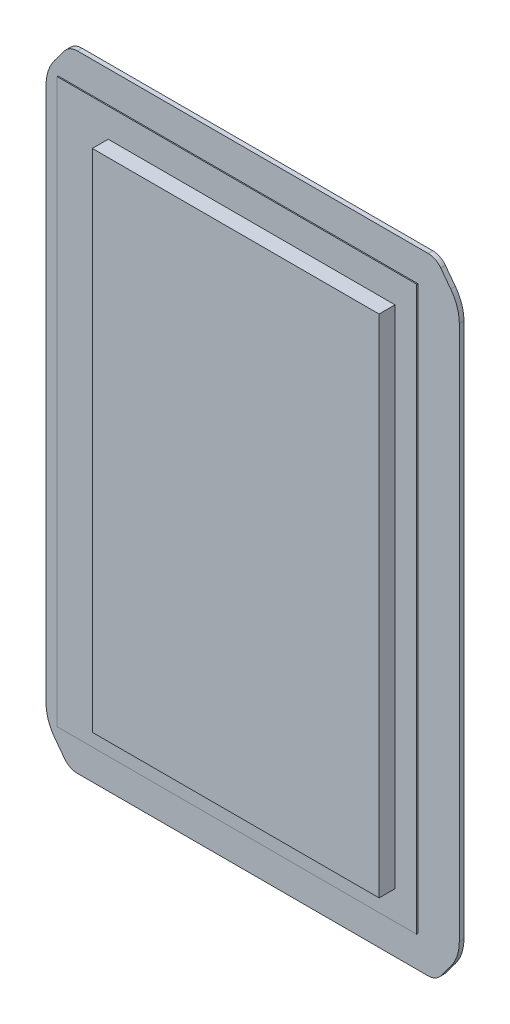
ISO-10303-21;
HEADER;
FILE_DESCRIPTION(('STEP AP214'),'2;1');
FILE_NAME('part.step','',(''),(''),'','','');
FILE_SCHEMA(('AUTOMOTIVE_DESIGN { 1 0 10303 214 1 1 1 1 }'));
ENDSEC;
DATA;
#1=APPLICATION_CONTEXT('core data for automotive mechanical design processes');
#2=APPLICATION_PROTOCOL_DEFINITION('international standard','automotive_design',2000,#1);
#3=PRODUCT_CONTEXT('',#1,'mechanical');
#4=PRODUCT('Part','Part','',(#3));
#5=PRODUCT_RELATED_PRODUCT_CATEGORY('part','',(#4));
#6=PRODUCT_DEFINITION_FORMATION('','',#4);
#7=PRODUCT_DEFINITION_CONTEXT('part definition',#1,'design');
#8=PRODUCT_DEFINITION('design','',#6,#7);
#9=PRODUCT_DEFINITION_SHAPE('','',#8);
#10=(LENGTH_UNIT() NAMED_UNIT(*) SI_UNIT(.MILLI.,.METRE.));
#11=(NAMED_UNIT(*) PLANE_ANGLE_UNIT() SI_UNIT($,.RADIAN.));
#12=(NAMED_UNIT(*) SI_UNIT($,.STERADIAN.) SOLID_ANGLE_UNIT());
#13=UNCERTAINTY_MEASURE_WITH_UNIT(LENGTH_MEASURE(1.E-05),#10,'distance_accuracy_value','');
#14=(GEOMETRIC_REPRESENTATION_CONTEXT(3) GLOBAL_UNCERTAINTY_ASSIGNED_CONTEXT((#13)) GLOBAL_UNIT_ASSIGNED_CONTEXT((#10,
#11,#12)) REPRESENTATION_CONTEXT('',''));
#15=CARTESIAN_POINT('',(0.,0.,0.));
#16=DIRECTION('',(0.,0.,1.));
#17=DIRECTION('',(1.,0.,0.));
#18=AXIS2_PLACEMENT_3D('',#15,#16,#17);
#19=CARTESIAN_POINT('',(0.,0.,1.075));
#20=DIRECTION('',(0.,0.,-1.));
#21=DIRECTION('',(-1.,0.,0.));
#22=AXIS2_PLACEMENT_3D('',#19,#20,#21);
#23=PLANE('',#22);
#24=DIRECTION('',(1.,0.,0.));
#25=VECTOR('',#24,1.);
#26=CARTESIAN_POINT('',(31.08,-53.,1.075));
#27=LINE('',#26,#25);
#28=CARTESIAN_POINT('',(-36.62,-53.,1.075));
#29=VERTEX_POINT('',#28);
#30=CARTESIAN_POINT('',(31.08,-53.,1.075));
#31=VERTEX_POINT('',#30);
#32=EDGE_CURVE('E256',#29,#31,#27,.T.);
#33=ORIENTED_EDGE('',*,*,#32,.T.);
#34=DIRECTION('',(0.,1.,0.));
#35=VECTOR('',#34,1.);
#36=CARTESIAN_POINT('',(31.08,53.,1.075));
#37=LINE('',#36,#35);
#38=CARTESIAN_POINT('',(31.08,53.,1.075));
#39=VERTEX_POINT('',#38);
#40=EDGE_CURVE('E261',#31,#39,#37,.T.);
#41=ORIENTED_EDGE('',*,*,#40,.T.);
#42=DIRECTION('',(-1.,0.,0.));
#43=VECTOR('',#42,1.);
#44=CARTESIAN_POINT('',(-36.62,53.,1.075));
#45=LINE('',#44,#43);
#46=CARTESIAN_POINT('',(-36.62,53.,1.075));
#47=VERTEX_POINT('',#46);
#48=EDGE_CURVE('E262',#39,#47,#45,.T.);
#49=ORIENTED_EDGE('',*,*,#48,.T.);
#50=DIRECTION('',(0.,-1.,0.));
#51=VECTOR('',#50,1.);
#52=CARTESIAN_POINT('',(-36.62,-53.,1.075));
#53=LINE('',#52,#51);
#54=EDGE_CURVE('E266',#47,#29,#53,.T.);
#55=ORIENTED_EDGE('',*,*,#54,.T.);
#56=EDGE_LOOP('',(#33,#41,#49,#55));
#57=FACE_BOUND('',#56,.T.);
#58=DIRECTION('',(0.,-1.,0.));
#59=VECTOR('',#58,1.);
#60=CARTESIAN_POINT('',(-27.,47.6,1.075));
#61=LINE('',#60,#59);
#62=CARTESIAN_POINT('',(-27.,47.6,1.075));
#63=VERTEX_POINT('',#62);
#64=CARTESIAN_POINT('',(-27.,-47.6,1.075));
#65=VERTEX_POINT('',#64);
#66=EDGE_CURVE('E248',#63,#65,#61,.T.);
#67=ORIENTED_EDGE('',*,*,#66,.F.);
#68=DIRECTION('',(-1.,0.,0.));
#69=VECTOR('',#68,1.);
#70=CARTESIAN_POINT('',(-27.,47.6,1.075));
#71=LINE('',#70,#69);
#72=CARTESIAN_POINT('',(27.,47.6,1.075));
#73=VERTEX_POINT('',#72);
#74=EDGE_CURVE('E244',#73,#63,#71,.T.);
#75=ORIENTED_EDGE('',*,*,#74,.F.);
#76=DIRECTION('',(0.,1.,0.));
#77=VECTOR('',#76,1.);
#78=CARTESIAN_POINT('',(27.,47.6,1.075));
#79=LINE('',#78,#77);
#80=CARTESIAN_POINT('',(27.,-47.6,1.075));
#81=VERTEX_POINT('',#80);
#82=EDGE_CURVE('E39',#81,#73,#79,.T.);
#83=ORIENTED_EDGE('',*,*,#82,.F.);
#84=DIRECTION('',(1.,0.,0.));
#85=VECTOR('',#84,1.);
#86=CARTESIAN_POINT('',(-27.,-47.6,1.075));
#87=LINE('',#86,#85);
#88=EDGE_CURVE('E35',#65,#81,#87,.T.);
#89=ORIENTED_EDGE('',*,*,#88,.F.);
#90=EDGE_LOOP('',(#67,#75,#83,#89));
#91=FACE_BOUND('',#90,.T.);
#92=ADVANCED_FACE('F18',(#57,#91),#23,.F.);
#93=CARTESIAN_POINT('',(30.9,50.4,0.875));
#94=DIRECTION('',(0.,0.,-1.));
#95=DIRECTION('',(-1.,0.,0.));
#96=AXIS2_PLACEMENT_3D('',#93,#94,#95);
#97=PLANE('',#96);
#98=CARTESIAN_POINT('',(30.9,50.4,0.875));
#99=DIRECTION('',(0.,0.,1.));
#100=DIRECTION('',(-1.,0.,0.));
#101=AXIS2_PLACEMENT_3D('',#98,#99,#100);
#102=CIRCLE('',#101,8.);
#103=CARTESIAN_POINT('',(38.9,50.4,0.875));
#104=VERTEX_POINT('',#103);
#105=CARTESIAN_POINT('',(37.2890840803784,55.2145201852164,0.875));
#106=VERTEX_POINT('',#105);
#107=EDGE_CURVE('E356',#104,#106,#102,.T.);
#108=ORIENTED_EDGE('',*,*,#107,.T.);
#109=DIRECTION('',(-0.601815023152051,0.798635510047291,0.));
#110=VECTOR('',#109,1.);
#111=CARTESIAN_POINT('',(35.4120375453576,57.7054450694562,0.875));
#112=LINE('',#111,#110);
#113=CARTESIAN_POINT('',(35.4120375453576,57.7054450694562,0.875));
#114=VERTEX_POINT('',#113);
#115=EDGE_CURVE('E357',#106,#114,#112,.T.);
#116=ORIENTED_EDGE('',*,*,#115,.T.);
#117=CARTESIAN_POINT('',(33.0161310152157,55.9,0.875));
#118=DIRECTION('',(0.,0.,1.));
#119=DIRECTION('',(-1.,0.,0.));
#120=AXIS2_PLACEMENT_3D('',#117,#118,#119);
#121=CIRCLE('',#120,3.);
#122=CARTESIAN_POINT('',(33.0161310152157,58.9,0.875));
#123=VERTEX_POINT('',#122);
#124=EDGE_CURVE('E362',#114,#123,#121,.T.);
#125=ORIENTED_EDGE('',*,*,#124,.T.);
#126=DIRECTION('',(-1.,0.,0.));
#127=VECTOR('',#126,1.);
#128=CARTESIAN_POINT('',(-33.0161310152157,58.9,0.875));
#129=LINE('',#128,#127);
#130=CARTESIAN_POINT('',(-33.0161310152157,58.9,0.875));
#131=VERTEX_POINT('',#130);
#132=EDGE_CURVE('E365',#123,#131,#129,.T.);
#133=ORIENTED_EDGE('',*,*,#132,.T.);
#134=CARTESIAN_POINT('',(-33.0161310152157,55.9,0.875));
#135=DIRECTION('',(0.,0.,1.));
#136=DIRECTION('',(1.,0.,0.));
#137=AXIS2_PLACEMENT_3D('',#134,#135,#136);
#138=CIRCLE('',#137,3.);
#139=CARTESIAN_POINT('',(-35.4120375453576,57.7054450694562,0.875));
#140=VERTEX_POINT('',#139);
#141=EDGE_CURVE('E368',#131,#140,#138,.T.);
#142=ORIENTED_EDGE('',*,*,#141,.T.);
#143=DIRECTION('',(-0.601815023152053,-0.79863551004729,0.));
#144=VECTOR('',#143,1.);
#145=CARTESIAN_POINT('',(-37.2890840803783,55.2145201852164,0.875));
#146=LINE('',#145,#144);
#147=CARTESIAN_POINT('',(-37.2890840803783,55.2145201852164,0.875));
#148=VERTEX_POINT('',#147);
#149=EDGE_CURVE('E366',#140,#148,#146,.T.);
#150=ORIENTED_EDGE('',*,*,#149,.T.);
#151=CARTESIAN_POINT('',(-30.9,50.4,0.875));
#152=DIRECTION('',(0.,0.,1.));
#153=DIRECTION('',(-1.,0.,0.));
#154=AXIS2_PLACEMENT_3D('',#151,#152,#153);
#155=CIRCLE('',#154,8.);
#156=CARTESIAN_POINT('',(-38.9,50.4,0.875));
#157=VERTEX_POINT('',#156);
#158=EDGE_CURVE('E367',#148,#157,#155,.T.);
#159=ORIENTED_EDGE('',*,*,#158,.T.);
#160=DIRECTION('',(0.,-1.,0.));
#161=VECTOR('',#160,1.);
#162=CARTESIAN_POINT('',(-38.9,-50.4,0.875));
#163=LINE('',#162,#161);
#164=CARTESIAN_POINT('',(-38.9,-50.4,0.875));
#165=VERTEX_POINT('',#164);
#166=EDGE_CURVE('E375',#157,#165,#163,.T.);
#167=ORIENTED_EDGE('',*,*,#166,.T.);
#168=CARTESIAN_POINT('',(-30.9,-50.4,0.875));
#169=DIRECTION('',(0.,0.,1.));
#170=DIRECTION('',(1.,0.,0.));
#171=AXIS2_PLACEMENT_3D('',#168,#169,#170);
#172=CIRCLE('',#171,8.);
#173=CARTESIAN_POINT('',(-37.2890840803784,-55.2145201852164,0.875));
#174=VERTEX_POINT('',#173);
#175=EDGE_CURVE('E372',#165,#174,#172,.T.);
#176=ORIENTED_EDGE('',*,*,#175,.T.);
#177=DIRECTION('',(0.601815023152046,-0.798635510047295,0.));
#178=VECTOR('',#177,1.);
#179=CARTESIAN_POINT('',(-35.4120375453576,-57.7054450694562,0.875));
#180=LINE('',#179,#178);
#181=CARTESIAN_POINT('',(-35.4120375453576,-57.7054450694562,0.875));
#182=VERTEX_POINT('',#181);
#183=EDGE_CURVE('E376',#174,#182,#180,.T.);
#184=ORIENTED_EDGE('',*,*,#183,.T.);
#185=CARTESIAN_POINT('',(-33.0161310152157,-55.9,0.875));
#186=DIRECTION('',(0.,0.,1.));
#187=DIRECTION('',(-1.,0.,0.));
#188=AXIS2_PLACEMENT_3D('',#185,#186,#187);
#189=CIRCLE('',#188,3.);
#190=CARTESIAN_POINT('',(-33.0161310152157,-58.9,0.875));
#191=VERTEX_POINT('',#190);
#192=EDGE_CURVE('E378',#182,#191,#189,.T.);
#193=ORIENTED_EDGE('',*,*,#192,.T.);
#194=DIRECTION('',(1.,0.,0.));
#195=VECTOR('',#194,1.);
#196=CARTESIAN_POINT('',(33.0161310152157,-58.9,0.875));
#197=LINE('',#196,#195);
#198=CARTESIAN_POINT('',(33.0161310152157,-58.9,0.875));
#199=VERTEX_POINT('',#198);
#200=EDGE_CURVE('E379',#191,#199,#197,.T.);
#201=ORIENTED_EDGE('',*,*,#200,.T.);
#202=CARTESIAN_POINT('',(33.0161310152157,-55.9,0.875));
#203=DIRECTION('',(0.,0.,1.));
#204=DIRECTION('',(-1.,0.,0.));
#205=AXIS2_PLACEMENT_3D('',#202,#203,#204);
#206=CIRCLE('',#205,3.);
#207=CARTESIAN_POINT('',(35.4120375453576,-57.7054450694561,0.875));
#208=VERTEX_POINT('',#207);
#209=EDGE_CURVE('E385',#199,#208,#206,.T.);
#210=ORIENTED_EDGE('',*,*,#209,.T.);
#211=DIRECTION('',(0.60181502315205,0.798635510047292,0.));
#212=VECTOR('',#211,1.);
#213=CARTESIAN_POINT('',(37.2890840803784,-55.2145201852164,0.875));
#214=LINE('',#213,#212);
#215=CARTESIAN_POINT('',(37.2890840803784,-55.2145201852164,0.875));
#216=VERTEX_POINT('',#215);
#217=EDGE_CURVE('E383',#208,#216,#214,.T.);
#218=ORIENTED_EDGE('',*,*,#217,.T.);
#219=CARTESIAN_POINT('',(30.9,-50.4,0.875));
#220=DIRECTION('',(0.,0.,1.));
#221=DIRECTION('',(-1.,0.,0.));
#222=AXIS2_PLACEMENT_3D('',#219,#220,#221);
#223=CIRCLE('',#222,8.);
#224=CARTESIAN_POINT('',(38.9,-50.4,0.875));
#225=VERTEX_POINT('',#224);
#226=EDGE_CURVE('E387',#216,#225,#223,.T.);
#227=ORIENTED_EDGE('',*,*,#226,.T.);
#228=DIRECTION('',(0.,1.,0.));
#229=VECTOR('',#228,1.);
#230=CARTESIAN_POINT('',(38.9,50.4,0.875));
#231=LINE('',#230,#229);
#232=EDGE_CURVE('E389',#225,#104,#231,.T.);
#233=ORIENTED_EDGE('',*,*,#232,.T.);
#234=EDGE_LOOP('',(#108,#116,#125,#133,#142,#150,#159,#167,#176,#184,#193,#201,#210,#218,#227,#233));
#235=FACE_BOUND('',#234,.T.);
#236=DIRECTION('',(1.,0.,0.));
#237=VECTOR('',#236,1.);
#238=CARTESIAN_POINT('',(31.08,-53.,0.875));
#239=LINE('',#238,#237);
#240=CARTESIAN_POINT('',(-36.62,-53.,0.875));
#241=VERTEX_POINT('',#240);
#242=CARTESIAN_POINT('',(31.08,-53.,0.875));
#243=VERTEX_POINT('',#242);
#244=EDGE_CURVE('E247',#241,#243,#239,.T.);
#245=ORIENTED_EDGE('',*,*,#244,.F.);
#246=DIRECTION('',(0.,-1.,0.));
#247=VECTOR('',#246,1.);
#248=CARTESIAN_POINT('',(-36.62,-53.,0.875));
#249=LINE('',#248,#247);
#250=CARTESIAN_POINT('',(-36.62,53.,0.875));
#251=VERTEX_POINT('',#250);
#252=EDGE_CURVE('E265',#251,#241,#249,.T.);
#253=ORIENTED_EDGE('',*,*,#252,.F.);
#254=DIRECTION('',(-1.,0.,0.));
#255=VECTOR('',#254,1.);
#256=CARTESIAN_POINT('',(-36.62,53.,0.875));
#257=LINE('',#256,#255);
#258=CARTESIAN_POINT('',(31.08,53.,0.875));
#259=VERTEX_POINT('',#258);
#260=EDGE_CURVE('E271',#259,#251,#257,.T.);
#261=ORIENTED_EDGE('',*,*,#260,.F.);
#262=DIRECTION('',(0.,1.,0.));
#263=VECTOR('',#262,1.);
#264=CARTESIAN_POINT('',(31.08,53.,0.875));
#265=LINE('',#264,#263);
#266=EDGE_CURVE('E252',#243,#259,#265,.T.);
#267=ORIENTED_EDGE('',*,*,#266,.F.);
#268=EDGE_LOOP('',(#245,#253,#261,#267));
#269=FACE_BOUND('',#268,.T.);
#270=ADVANCED_FACE('F486',(#235,#269),#97,.F.);
#271=CARTESIAN_POINT('',(30.9,50.4,0.875));
#272=DIRECTION('',(0.,0.,-1.));
#273=DIRECTION('',(-1.,0.,0.));
#274=AXIS2_PLACEMENT_3D('',#271,#272,#273);
#275=CYLINDRICAL_SURFACE('',#274,8.);
#276=CARTESIAN_POINT('',(30.9,50.4,0.));
#277=DIRECTION('',(0.,0.,1.));
#278=DIRECTION('',(-1.,0.,0.));
#279=AXIS2_PLACEMENT_3D('',#276,#277,#278);
#280=CIRCLE('',#279,8.);
#281=CARTESIAN_POINT('',(38.9,50.4,0.));
#282=VERTEX_POINT('',#281);
#283=CARTESIAN_POINT('',(37.2890840803784,55.2145201852164,0.));
#284=VERTEX_POINT('',#283);
#285=EDGE_CURVE('E346',#282,#284,#280,.T.);
#286=ORIENTED_EDGE('',*,*,#285,.T.);
#287=DIRECTION('',(0.,0.,-1.));
#288=VECTOR('',#287,1.);
#289=CARTESIAN_POINT('',(37.2890840803784,55.2145201852164,0.875));
#290=LINE('',#289,#288);
#291=EDGE_CURVE('E11',#106,#284,#290,.T.);
#292=ORIENTED_EDGE('',*,*,#291,.F.);
#293=ORIENTED_EDGE('',*,*,#107,.F.);
#294=DIRECTION('',(0.,0.,-1.));
#295=VECTOR('',#294,1.);
#296=CARTESIAN_POINT('',(38.9,50.4,0.875));
#297=LINE('',#296,#295);
#298=EDGE_CURVE('E388',#104,#282,#297,.T.);
#299=ORIENTED_EDGE('',*,*,#298,.T.);
#300=EDGE_LOOP('',(#286,#292,#293,#299));
#301=FACE_BOUND('',#300,.T.);
#302=ADVANCED_FACE('F20',(#301),#275,.T.);
#303=CARTESIAN_POINT('',(35.4120375453576,57.7054450694562,0.875));
#304=DIRECTION('',(-0.798635510047291,-0.601815023152051,0.));
#305=DIRECTION('',(0.601815023152051,-0.798635510047291,0.));
#306=AXIS2_PLACEMENT_3D('',#303,#304,#305);
#307=PLANE('',#306);
#308=DIRECTION('',(-0.601815023152051,0.798635510047291,0.));
#309=VECTOR('',#308,1.);
#310=CARTESIAN_POINT('',(35.4120375453576,57.7054450694562,0.));
#311=LINE('',#310,#309);
#312=CARTESIAN_POINT('',(35.4120375453576,57.7054450694562,0.));
#313=VERTEX_POINT('',#312);
#314=EDGE_CURVE('E394',#284,#313,#311,.T.);
#315=ORIENTED_EDGE('',*,*,#314,.T.);
#316=DIRECTION('',(0.,0.,-1.));
#317=VECTOR('',#316,1.);
#318=CARTESIAN_POINT('',(35.4120375453576,57.7054450694562,0.875));
#319=LINE('',#318,#317);
#320=EDGE_CURVE('E30',#114,#313,#319,.T.);
#321=ORIENTED_EDGE('',*,*,#320,.F.);
#322=ORIENTED_EDGE('',*,*,#115,.F.);
#323=ORIENTED_EDGE('',*,*,#291,.T.);
#324=EDGE_LOOP('',(#315,#321,#322,#323));
#325=FACE_BOUND('',#324,.T.);
#326=ADVANCED_FACE('F491',(#325),#307,.F.);
#327=CARTESIAN_POINT('',(33.0161310152157,55.9,0.875));
#328=DIRECTION('',(0.,0.,-1.));
#329=DIRECTION('',(-1.,0.,0.));
#330=AXIS2_PLACEMENT_3D('',#327,#328,#329);
#331=CYLINDRICAL_SURFACE('',#330,3.);
#332=CARTESIAN_POINT('',(33.0161310152157,55.9,0.));
#333=DIRECTION('',(0.,0.,1.));
#334=DIRECTION('',(-1.,0.,0.));
#335=AXIS2_PLACEMENT_3D('',#332,#333,#334);
#336=CIRCLE('',#335,3.);
#337=CARTESIAN_POINT('',(33.0161310152157,58.9,0.));
#338=VERTEX_POINT('',#337);
#339=EDGE_CURVE('E395',#313,#338,#336,.T.);
#340=ORIENTED_EDGE('',*,*,#339,.T.);
#341=DIRECTION('',(0.,0.,-1.));
#342=VECTOR('',#341,1.);
#343=CARTESIAN_POINT('',(33.0161310152157,58.9,0.875));
#344=LINE('',#343,#342);
#345=EDGE_CURVE('E459',#123,#338,#344,.T.);
#346=ORIENTED_EDGE('',*,*,#345,.F.);
#347=ORIENTED_EDGE('',*,*,#124,.F.);
#348=ORIENTED_EDGE('',*,*,#320,.T.);
#349=EDGE_LOOP('',(#340,#346,#347,#348));
#350=FACE_BOUND('',#349,.T.);
#351=ADVANCED_FACE('F470',(#350),#331,.T.);
#352=CARTESIAN_POINT('',(-33.0161310152157,58.9,0.875));
#353=DIRECTION('',(0.,-1.,0.));
#354=DIRECTION('',(0.,0.,-1.));
#355=AXIS2_PLACEMENT_3D('',#352,#353,#354);
#356=PLANE('',#355);
#357=DIRECTION('',(-1.,0.,0.));
#358=VECTOR('',#357,1.);
#359=CARTESIAN_POINT('',(-33.0161310152157,58.9,0.));
#360=LINE('',#359,#358);
#361=CARTESIAN_POINT('',(-33.0161310152157,58.9,0.));
#362=VERTEX_POINT('',#361);
#363=EDGE_CURVE('E400',#338,#362,#360,.T.);
#364=ORIENTED_EDGE('',*,*,#363,.T.);
#365=DIRECTION('',(0.,0.,-1.));
#366=VECTOR('',#365,1.);
#367=CARTESIAN_POINT('',(-33.0161310152157,58.9,0.875));
#368=LINE('',#367,#366);
#369=EDGE_CURVE('E456',#131,#362,#368,.T.);
#370=ORIENTED_EDGE('',*,*,#369,.F.);
#371=ORIENTED_EDGE('',*,*,#132,.F.);
#372=ORIENTED_EDGE('',*,*,#345,.T.);
#373=EDGE_LOOP('',(#364,#370,#371,#372));
#374=FACE_BOUND('',#373,.T.);
#375=ADVANCED_FACE('F476',(#374),#356,.F.);
#376=CARTESIAN_POINT('',(-33.0161310152157,55.9,0.875));
#377=DIRECTION('',(0.,0.,-1.));
#378=DIRECTION('',(-1.,0.,0.));
#379=AXIS2_PLACEMENT_3D('',#376,#377,#378);
#380=CYLINDRICAL_SURFACE('',#379,3.);
#381=CARTESIAN_POINT('',(-33.0161310152157,55.9,0.));
#382=DIRECTION('',(0.,0.,1.));
#383=DIRECTION('',(1.,0.,0.));
#384=AXIS2_PLACEMENT_3D('',#381,#382,#383);
#385=CIRCLE('',#384,3.);
#386=CARTESIAN_POINT('',(-35.4120375453576,57.7054450694562,0.));
#387=VERTEX_POINT('',#386);
#388=EDGE_CURVE('E396',#362,#387,#385,.T.);
#389=ORIENTED_EDGE('',*,*,#388,.T.);
#390=DIRECTION('',(0.,0.,-1.));
#391=VECTOR('',#390,1.);
#392=CARTESIAN_POINT('',(-35.4120375453576,57.7054450694562,0.875));
#393=LINE('',#392,#391);
#394=EDGE_CURVE('E451',#140,#387,#393,.T.);
#395=ORIENTED_EDGE('',*,*,#394,.F.);
#396=ORIENTED_EDGE('',*,*,#141,.F.);
#397=ORIENTED_EDGE('',*,*,#369,.T.);
#398=EDGE_LOOP('',(#389,#395,#396,#397));
#399=FACE_BOUND('',#398,.T.);
#400=ADVANCED_FACE('F485',(#399),#380,.T.);
#401=CARTESIAN_POINT('',(-37.2890840803783,55.2145201852164,0.875));
#402=DIRECTION('',(0.798635510047289,-0.601815023152053,0.));
#403=DIRECTION('',(0.601815023152053,0.798635510047289,0.));
#404=AXIS2_PLACEMENT_3D('',#401,#402,#403);
#405=PLANE('',#404);
#406=DIRECTION('',(-0.601815023152053,-0.79863551004729,0.));
#407=VECTOR('',#406,1.);
#408=CARTESIAN_POINT('',(-37.2890840803783,55.2145201852164,0.));
#409=LINE('',#408,#407);
#410=CARTESIAN_POINT('',(-37.2890840803783,55.2145201852164,0.));
#411=VERTEX_POINT('',#410);
#412=EDGE_CURVE('E405',#387,#411,#409,.T.);
#413=ORIENTED_EDGE('',*,*,#412,.T.);
#414=DIRECTION('',(0.,0.,-1.));
#415=VECTOR('',#414,1.);
#416=CARTESIAN_POINT('',(-37.2890840803783,55.2145201852164,0.875));
#417=LINE('',#416,#415);
#418=EDGE_CURVE('E452',#148,#411,#417,.T.);
#419=ORIENTED_EDGE('',*,*,#418,.F.);
#420=ORIENTED_EDGE('',*,*,#149,.F.);
#421=ORIENTED_EDGE('',*,*,#394,.T.);
#422=EDGE_LOOP('',(#413,#419,#420,#421));
#423=FACE_BOUND('',#422,.T.);
#424=ADVANCED_FACE('F542',(#423),#405,.F.);
#425=CARTESIAN_POINT('',(-30.9,50.4,0.875));
#426=DIRECTION('',(0.,0.,-1.));
#427=DIRECTION('',(-1.,0.,0.));
#428=AXIS2_PLACEMENT_3D('',#425,#426,#427);
#429=CYLINDRICAL_SURFACE('',#428,8.);
#430=CARTESIAN_POINT('',(-30.9,50.4,0.));
#431=DIRECTION('',(0.,0.,1.));
#432=DIRECTION('',(-1.,0.,0.));
#433=AXIS2_PLACEMENT_3D('',#430,#431,#432);
#434=CIRCLE('',#433,8.);
#435=CARTESIAN_POINT('',(-38.9,50.4,0.));
#436=VERTEX_POINT('',#435);
#437=EDGE_CURVE('E403',#411,#436,#434,.T.);
#438=ORIENTED_EDGE('',*,*,#437,.T.);
#439=DIRECTION('',(0.,0.,-1.));
#440=VECTOR('',#439,1.);
#441=CARTESIAN_POINT('',(-38.9,50.4,0.875));
#442=LINE('',#441,#440);
#443=EDGE_CURVE('E449',#157,#436,#442,.T.);
#444=ORIENTED_EDGE('',*,*,#443,.F.);
#445=ORIENTED_EDGE('',*,*,#158,.F.);
#446=ORIENTED_EDGE('',*,*,#418,.T.);
#447=EDGE_LOOP('',(#438,#444,#445,#446));
#448=FACE_BOUND('',#447,.T.);
#449=ADVANCED_FACE('F541',(#448),#429,.T.);
#450=CARTESIAN_POINT('',(-38.9,-50.4,0.875));
#451=DIRECTION('',(1.,0.,0.));
#452=DIRECTION('',(0.,0.,-1.));
#453=AXIS2_PLACEMENT_3D('',#450,#451,#452);
#454=PLANE('',#453);
#455=DIRECTION('',(0.,-1.,0.));
#456=VECTOR('',#455,1.);
#457=CARTESIAN_POINT('',(-38.9,-50.4,0.));
#458=LINE('',#457,#456);
#459=CARTESIAN_POINT('',(-38.9,-50.4,0.));
#460=VERTEX_POINT('',#459);
#461=EDGE_CURVE('E404',#436,#460,#458,.T.);
#462=ORIENTED_EDGE('',*,*,#461,.T.);
#463=DIRECTION('',(0.,0.,-1.));
#464=VECTOR('',#463,1.);
#465=CARTESIAN_POINT('',(-38.9,-50.4,0.875));
#466=LINE('',#465,#464);
#467=EDGE_CURVE('E443',#165,#460,#466,.T.);
#468=ORIENTED_EDGE('',*,*,#467,.F.);
#469=ORIENTED_EDGE('',*,*,#166,.F.);
#470=ORIENTED_EDGE('',*,*,#443,.T.);
#471=EDGE_LOOP('',(#462,#468,#469,#470));
#472=FACE_BOUND('',#471,.T.);
#473=ADVANCED_FACE('F540',(#472),#454,.F.);
#474=CARTESIAN_POINT('',(-30.9,-50.4,0.875));
#475=DIRECTION('',(0.,0.,-1.));
#476=DIRECTION('',(-1.,0.,0.));
#477=AXIS2_PLACEMENT_3D('',#474,#475,#476);
#478=CYLINDRICAL_SURFACE('',#477,8.);
#479=CARTESIAN_POINT('',(-30.9,-50.4,0.));
#480=DIRECTION('',(0.,0.,1.));
#481=DIRECTION('',(1.,0.,0.));
#482=AXIS2_PLACEMENT_3D('',#479,#480,#481);
#483=CIRCLE('',#482,8.);
#484=CARTESIAN_POINT('',(-37.2890840803784,-55.2145201852164,0.));
#485=VERTEX_POINT('',#484);
#486=EDGE_CURVE('E410',#460,#485,#483,.T.);
#487=ORIENTED_EDGE('',*,*,#486,.T.);
#488=DIRECTION('',(0.,0.,-1.));
#489=VECTOR('',#488,1.);
#490=CARTESIAN_POINT('',(-37.2890840803784,-55.2145201852164,0.875));
#491=LINE('',#490,#489);
#492=EDGE_CURVE('E445',#174,#485,#491,.T.);
#493=ORIENTED_EDGE('',*,*,#492,.F.);
#494=ORIENTED_EDGE('',*,*,#175,.F.);
#495=ORIENTED_EDGE('',*,*,#467,.T.);
#496=EDGE_LOOP('',(#487,#493,#494,#495));
#497=FACE_BOUND('',#496,.T.);
#498=ADVANCED_FACE('F531',(#497),#478,.T.);
#499=CARTESIAN_POINT('',(-35.4120375453576,-57.7054450694562,0.875));
#500=DIRECTION('',(0.798635510047295,0.601815023152046,0.));
#501=DIRECTION('',(-0.601815023152046,0.798635510047295,0.));
#502=AXIS2_PLACEMENT_3D('',#499,#500,#501);
#503=PLANE('',#502);
#504=DIRECTION('',(0.601815023152046,-0.798635510047295,0.));
#505=VECTOR('',#504,1.);
#506=CARTESIAN_POINT('',(-35.4120375453576,-57.7054450694562,0.));
#507=LINE('',#506,#505);
#508=CARTESIAN_POINT('',(-35.4120375453576,-57.7054450694562,0.));
#509=VERTEX_POINT('',#508);
#510=EDGE_CURVE('E408',#485,#509,#507,.T.);
#511=ORIENTED_EDGE('',*,*,#510,.T.);
#512=DIRECTION('',(0.,0.,-1.));
#513=VECTOR('',#512,1.);
#514=CARTESIAN_POINT('',(-35.4120375453576,-57.7054450694562,0.875));
#515=LINE('',#514,#513);
#516=EDGE_CURVE('E438',#182,#509,#515,.T.);
#517=ORIENTED_EDGE('',*,*,#516,.F.);
#518=ORIENTED_EDGE('',*,*,#183,.F.);
#519=ORIENTED_EDGE('',*,*,#492,.T.);
#520=EDGE_LOOP('',(#511,#517,#518,#519));
#521=FACE_BOUND('',#520,.T.);
#522=ADVANCED_FACE('F526',(#521),#503,.F.);
#523=CARTESIAN_POINT('',(-33.0161310152157,-55.9,0.875));
#524=DIRECTION('',(0.,0.,-1.));
#525=DIRECTION('',(-1.,0.,0.));
#526=AXIS2_PLACEMENT_3D('',#523,#524,#525);
#527=CYLINDRICAL_SURFACE('',#526,3.);
#528=CARTESIAN_POINT('',(-33.0161310152157,-55.9,0.));
#529=DIRECTION('',(0.,0.,1.));
#530=DIRECTION('',(-1.,0.,0.));
#531=AXIS2_PLACEMENT_3D('',#528,#529,#530);
#532=CIRCLE('',#531,3.);
#533=CARTESIAN_POINT('',(-33.0161310152157,-58.9,0.));
#534=VERTEX_POINT('',#533);
#535=EDGE_CURVE('E411',#509,#534,#532,.T.);
#536=ORIENTED_EDGE('',*,*,#535,.T.);
#537=DIRECTION('',(0.,0.,-1.));
#538=VECTOR('',#537,1.);
#539=CARTESIAN_POINT('',(-33.0161310152157,-58.9,0.875));
#540=LINE('',#539,#538);
#541=EDGE_CURVE('E436',#191,#534,#540,.T.);
#542=ORIENTED_EDGE('',*,*,#541,.F.);
#543=ORIENTED_EDGE('',*,*,#192,.F.);
#544=ORIENTED_EDGE('',*,*,#516,.T.);
#545=EDGE_LOOP('',(#536,#542,#543,#544));
#546=FACE_BOUND('',#545,.T.);
#547=ADVANCED_FACE('F525',(#546),#527,.T.);
#548=CARTESIAN_POINT('',(33.0161310152157,-58.9,0.875));
#549=DIRECTION('',(0.,1.,0.));
#550=DIRECTION('',(0.,0.,1.));
#551=AXIS2_PLACEMENT_3D('',#548,#549,#550);
#552=PLANE('',#551);
#553=DIRECTION('',(1.,0.,0.));
#554=VECTOR('',#553,1.);
#555=CARTESIAN_POINT('',(33.0161310152157,-58.9,0.));
#556=LINE('',#555,#554);
#557=CARTESIAN_POINT('',(33.0161310152157,-58.9,0.));
#558=VERTEX_POINT('',#557);
#559=EDGE_CURVE('E413',#534,#558,#556,.T.);
#560=ORIENTED_EDGE('',*,*,#559,.T.);
#561=DIRECTION('',(0.,0.,-1.));
#562=VECTOR('',#561,1.);
#563=CARTESIAN_POINT('',(33.0161310152157,-58.9,0.875));
#564=LINE('',#563,#562);
#565=EDGE_CURVE('E433',#199,#558,#564,.T.);
#566=ORIENTED_EDGE('',*,*,#565,.F.);
#567=ORIENTED_EDGE('',*,*,#200,.F.);
#568=ORIENTED_EDGE('',*,*,#541,.T.);
#569=EDGE_LOOP('',(#560,#566,#567,#568));
#570=FACE_BOUND('',#569,.T.);
#571=ADVANCED_FACE('F517',(#570),#552,.F.);
#572=CARTESIAN_POINT('',(33.0161310152157,-55.9,0.875));
#573=DIRECTION('',(0.,0.,-1.));
#574=DIRECTION('',(-1.,0.,0.));
#575=AXIS2_PLACEMENT_3D('',#572,#573,#574);
#576=CYLINDRICAL_SURFACE('',#575,3.);
#577=CARTESIAN_POINT('',(33.0161310152157,-55.9,0.));
#578=DIRECTION('',(0.,0.,1.));
#579=DIRECTION('',(-1.,0.,0.));
#580=AXIS2_PLACEMENT_3D('',#577,#578,#579);
#581=CIRCLE('',#580,3.);
#582=CARTESIAN_POINT('',(35.4120375453576,-57.7054450694561,0.));
#583=VERTEX_POINT('',#582);
#584=EDGE_CURVE('E414',#558,#583,#581,.T.);
#585=ORIENTED_EDGE('',*,*,#584,.T.);
#586=DIRECTION('',(0.,0.,-1.));
#587=VECTOR('',#586,1.);
#588=CARTESIAN_POINT('',(35.4120375453576,-57.7054450694561,0.875));
#589=LINE('',#588,#587);
#590=EDGE_CURVE('E429',#208,#583,#589,.T.);
#591=ORIENTED_EDGE('',*,*,#590,.F.);
#592=ORIENTED_EDGE('',*,*,#209,.F.);
#593=ORIENTED_EDGE('',*,*,#565,.T.);
#594=EDGE_LOOP('',(#585,#591,#592,#593));
#595=FACE_BOUND('',#594,.T.);
#596=ADVANCED_FACE('F513',(#595),#576,.T.);
#597=CARTESIAN_POINT('',(37.2890840803784,-55.2145201852164,0.875));
#598=DIRECTION('',(-0.798635510047292,0.60181502315205,0.));
#599=DIRECTION('',(-0.60181502315205,-0.798635510047292,0.));
#600=AXIS2_PLACEMENT_3D('',#597,#598,#599);
#601=PLANE('',#600);
#602=DIRECTION('',(0.60181502315205,0.798635510047292,0.));
#603=VECTOR('',#602,1.);
#604=CARTESIAN_POINT('',(37.2890840803784,-55.2145201852164,0.));
#605=LINE('',#604,#603);
#606=CARTESIAN_POINT('',(37.2890840803784,-55.2145201852164,0.));
#607=VERTEX_POINT('',#606);
#608=EDGE_CURVE('E417',#583,#607,#605,.T.);
#609=ORIENTED_EDGE('',*,*,#608,.T.);
#610=DIRECTION('',(0.,0.,-1.));
#611=VECTOR('',#610,1.);
#612=CARTESIAN_POINT('',(37.2890840803784,-55.2145201852164,0.875));
#613=LINE('',#612,#611);
#614=EDGE_CURVE('E430',#216,#607,#613,.T.);
#615=ORIENTED_EDGE('',*,*,#614,.F.);
#616=ORIENTED_EDGE('',*,*,#217,.F.);
#617=ORIENTED_EDGE('',*,*,#590,.T.);
#618=EDGE_LOOP('',(#609,#615,#616,#617));
#619=FACE_BOUND('',#618,.T.);
#620=ADVANCED_FACE('F510',(#619),#601,.F.);
#621=CARTESIAN_POINT('',(30.9,-50.4,0.875));
#622=DIRECTION('',(0.,0.,-1.));
#623=DIRECTION('',(-1.,0.,0.));
#624=AXIS2_PLACEMENT_3D('',#621,#622,#623);
#625=CYLINDRICAL_SURFACE('',#624,8.);
#626=CARTESIAN_POINT('',(30.9,-50.4,0.));
#627=DIRECTION('',(0.,0.,1.));
#628=DIRECTION('',(-1.,0.,0.));
#629=AXIS2_PLACEMENT_3D('',#626,#627,#628);
#630=CIRCLE('',#629,8.);
#631=CARTESIAN_POINT('',(38.9,-50.4,0.));
#632=VERTEX_POINT('',#631);
#633=EDGE_CURVE('E420',#607,#632,#630,.T.);
#634=ORIENTED_EDGE('',*,*,#633,.T.);
#635=DIRECTION('',(0.,0.,-1.));
#636=VECTOR('',#635,1.);
#637=CARTESIAN_POINT('',(38.9,-50.4,0.875));
#638=LINE('',#637,#636);
#639=EDGE_CURVE('E424',#225,#632,#638,.T.);
#640=ORIENTED_EDGE('',*,*,#639,.F.);
#641=ORIENTED_EDGE('',*,*,#226,.F.);
#642=ORIENTED_EDGE('',*,*,#614,.T.);
#643=EDGE_LOOP('',(#634,#640,#641,#642));
#644=FACE_BOUND('',#643,.T.);
#645=ADVANCED_FACE('F504',(#644),#625,.T.);
#646=CARTESIAN_POINT('',(38.9,50.4,0.875));
#647=DIRECTION('',(-1.,0.,0.));
#648=DIRECTION('',(0.,0.,1.));
#649=AXIS2_PLACEMENT_3D('',#646,#647,#648);
#650=PLANE('',#649);
#651=DIRECTION('',(0.,1.,0.));
#652=VECTOR('',#651,1.);
#653=CARTESIAN_POINT('',(38.9,50.4,0.));
#654=LINE('',#653,#652);
#655=EDGE_CURVE('E359',#632,#282,#654,.T.);
#656=ORIENTED_EDGE('',*,*,#655,.T.);
#657=ORIENTED_EDGE('',*,*,#298,.F.);
#658=ORIENTED_EDGE('',*,*,#232,.F.);
#659=ORIENTED_EDGE('',*,*,#639,.T.);
#660=EDGE_LOOP('',(#656,#657,#658,#659));
#661=FACE_BOUND('',#660,.T.);
#662=ADVANCED_FACE('F499',(#661),#650,.F.);
#663=CARTESIAN_POINT('',(30.9,50.4,0.));
#664=DIRECTION('',(0.,0.,-1.));
#665=DIRECTION('',(-1.,0.,0.));
#666=AXIS2_PLACEMENT_3D('',#663,#664,#665);
#667=PLANE('',#666);
#668=DIRECTION('',(0.,-1.,0.));
#669=VECTOR('',#668,1.);
#670=CARTESIAN_POINT('',(27.,47.6,0.));
#671=LINE('',#670,#669);
#672=CARTESIAN_POINT('',(27.,47.6,0.));
#673=VERTEX_POINT('',#672);
#674=CARTESIAN_POINT('',(27.,-47.6,0.));
#675=VERTEX_POINT('',#674);
#676=EDGE_CURVE('E290',#673,#675,#671,.T.);
#677=ORIENTED_EDGE('',*,*,#676,.F.);
#678=DIRECTION('',(1.,0.,0.));
#679=VECTOR('',#678,1.);
#680=CARTESIAN_POINT('',(27.,47.6,0.));
#681=LINE('',#680,#679);
#682=CARTESIAN_POINT('',(-27.,47.6,0.));
#683=VERTEX_POINT('',#682);
#684=EDGE_CURVE('E291',#683,#673,#681,.T.);
#685=ORIENTED_EDGE('',*,*,#684,.F.);
#686=DIRECTION('',(0.,1.,0.));
#687=VECTOR('',#686,1.);
#688=CARTESIAN_POINT('',(-27.,47.6,0.));
#689=LINE('',#688,#687);
#690=CARTESIAN_POINT('',(-27.,-47.6,0.));
#691=VERTEX_POINT('',#690);
#692=EDGE_CURVE('E308',#691,#683,#689,.T.);
#693=ORIENTED_EDGE('',*,*,#692,.F.);
#694=DIRECTION('',(-1.,0.,0.));
#695=VECTOR('',#694,1.);
#696=CARTESIAN_POINT('',(27.,-47.6,0.));
#697=LINE('',#696,#695);
#698=EDGE_CURVE('E303',#675,#691,#697,.T.);
#699=ORIENTED_EDGE('',*,*,#698,.F.);
#700=EDGE_LOOP('',(#677,#685,#693,#699));
#701=FACE_BOUND('',#700,.T.);
#702=ORIENTED_EDGE('',*,*,#285,.F.);
#703=ORIENTED_EDGE('',*,*,#655,.F.);
#704=ORIENTED_EDGE('',*,*,#633,.F.);
#705=ORIENTED_EDGE('',*,*,#608,.F.);
#706=ORIENTED_EDGE('',*,*,#584,.F.);
#707=ORIENTED_EDGE('',*,*,#559,.F.);
#708=ORIENTED_EDGE('',*,*,#535,.F.);
#709=ORIENTED_EDGE('',*,*,#510,.F.);
#710=ORIENTED_EDGE('',*,*,#486,.F.);
#711=ORIENTED_EDGE('',*,*,#461,.F.);
#712=ORIENTED_EDGE('',*,*,#437,.F.);
#713=ORIENTED_EDGE('',*,*,#412,.F.);
#714=ORIENTED_EDGE('',*,*,#388,.F.);
#715=ORIENTED_EDGE('',*,*,#363,.F.);
#716=ORIENTED_EDGE('',*,*,#339,.F.);
#717=ORIENTED_EDGE('',*,*,#314,.F.);
#718=EDGE_LOOP('',(#702,#703,#704,#705,#706,#707,#708,#709,#710,#711,#712,#713,#714,#715,#716,#717));
#719=FACE_BOUND('',#718,.T.);
#720=ADVANCED_FACE('F471',(#701,#719),#667,.T.);
#721=CARTESIAN_POINT('',(27.,47.6,0.001));
#722=DIRECTION('',(1.,0.,0.));
#723=DIRECTION('',(0.,1.,0.));
#724=AXIS2_PLACEMENT_3D('',#721,#722,#723);
#725=PLANE('',#724);
#726=ORIENTED_EDGE('',*,*,#676,.T.);
#727=DIRECTION('',(0.,0.,-1.));
#728=VECTOR('',#727,1.);
#729=CARTESIAN_POINT('',(27.,-47.6,0.001));
#730=LINE('',#729,#728);
#731=CARTESIAN_POINT('',(27.,-47.6,0.001));
#732=VERTEX_POINT('',#731);
#733=EDGE_CURVE('E301',#732,#675,#730,.T.);
#734=ORIENTED_EDGE('',*,*,#733,.F.);
#735=DIRECTION('',(0.,-1.,0.));
#736=VECTOR('',#735,1.);
#737=CARTESIAN_POINT('',(27.,47.6,0.001));
#738=LINE('',#737,#736);
#739=CARTESIAN_POINT('',(27.,47.6,0.001));
#740=VERTEX_POINT('',#739);
#741=EDGE_CURVE('E289',#740,#732,#738,.T.);
#742=ORIENTED_EDGE('',*,*,#741,.F.);
#743=DIRECTION('',(0.,0.,-1.));
#744=VECTOR('',#743,1.);
#745=CARTESIAN_POINT('',(27.,47.6,0.001));
#746=LINE('',#745,#744);
#747=EDGE_CURVE('E313',#740,#673,#746,.T.);
#748=ORIENTED_EDGE('',*,*,#747,.T.);
#749=EDGE_LOOP('',(#726,#734,#742,#748));
#750=FACE_BOUND('',#749,.T.);
#751=ADVANCED_FACE('F598',(#750),#725,.F.);
#752=CARTESIAN_POINT('',(27.,47.6,0.001));
#753=DIRECTION('',(0.,1.,0.));
#754=DIRECTION('',(0.,0.,1.));
#755=AXIS2_PLACEMENT_3D('',#752,#753,#754);
#756=PLANE('',#755);
#757=ORIENTED_EDGE('',*,*,#684,.T.);
#758=ORIENTED_EDGE('',*,*,#747,.F.);
#759=DIRECTION('',(1.,0.,0.));
#760=VECTOR('',#759,1.);
#761=CARTESIAN_POINT('',(27.,47.6,0.001));
#762=LINE('',#761,#760);
#763=CARTESIAN_POINT('',(-27.,47.6,0.001));
#764=VERTEX_POINT('',#763);
#765=EDGE_CURVE('E297',#764,#740,#762,.T.);
#766=ORIENTED_EDGE('',*,*,#765,.F.);
#767=DIRECTION('',(0.,0.,-1.));
#768=VECTOR('',#767,1.);
#769=CARTESIAN_POINT('',(-27.,47.6,0.001));
#770=LINE('',#769,#768);
#771=EDGE_CURVE('E314',#764,#683,#770,.T.);
#772=ORIENTED_EDGE('',*,*,#771,.T.);
#773=EDGE_LOOP('',(#757,#758,#766,#772));
#774=FACE_BOUND('',#773,.T.);
#775=ADVANCED_FACE('F592',(#774),#756,.F.);
#776=CARTESIAN_POINT('',(-27.,47.6,0.001));
#777=DIRECTION('',(-1.,0.,0.));
#778=DIRECTION('',(0.,-1.,0.));
#779=AXIS2_PLACEMENT_3D('',#776,#777,#778);
#780=PLANE('',#779);
#781=ORIENTED_EDGE('',*,*,#692,.T.);
#782=ORIENTED_EDGE('',*,*,#771,.F.);
#783=DIRECTION('',(0.,1.,0.));
#784=VECTOR('',#783,1.);
#785=CARTESIAN_POINT('',(-27.,47.6,0.001));
#786=LINE('',#785,#784);
#787=CARTESIAN_POINT('',(-27.,-47.6,0.001));
#788=VERTEX_POINT('',#787);
#789=EDGE_CURVE('E294',#788,#764,#786,.T.);
#790=ORIENTED_EDGE('',*,*,#789,.F.);
#791=DIRECTION('',(0.,0.,-1.));
#792=VECTOR('',#791,1.);
#793=CARTESIAN_POINT('',(-27.,-47.6,0.001));
#794=LINE('',#793,#792);
#795=EDGE_CURVE('E316',#788,#691,#794,.T.);
#796=ORIENTED_EDGE('',*,*,#795,.T.);
#797=EDGE_LOOP('',(#781,#782,#790,#796));
#798=FACE_BOUND('',#797,.T.);
#799=ADVANCED_FACE('F600',(#798),#780,.F.);
#800=CARTESIAN_POINT('',(27.,-47.6,0.001));
#801=DIRECTION('',(0.,-1.,0.));
#802=DIRECTION('',(0.,0.,-1.));
#803=AXIS2_PLACEMENT_3D('',#800,#801,#802);
#804=PLANE('',#803);
#805=ORIENTED_EDGE('',*,*,#698,.T.);
#806=ORIENTED_EDGE('',*,*,#795,.F.);
#807=DIRECTION('',(-1.,0.,0.));
#808=VECTOR('',#807,1.);
#809=CARTESIAN_POINT('',(27.,-47.6,0.001));
#810=LINE('',#809,#808);
#811=EDGE_CURVE('E295',#732,#788,#810,.T.);
#812=ORIENTED_EDGE('',*,*,#811,.F.);
#813=ORIENTED_EDGE('',*,*,#733,.T.);
#814=EDGE_LOOP('',(#805,#806,#812,#813));
#815=FACE_BOUND('',#814,.T.);
#816=ADVANCED_FACE('F595',(#815),#804,.F.);
#817=CARTESIAN_POINT('',(0.,0.,0.001));
#818=DIRECTION('',(0.,0.,-1.));
#819=DIRECTION('',(-1.,0.,0.));
#820=AXIS2_PLACEMENT_3D('',#817,#818,#819);
#821=PLANE('',#820);
#822=ORIENTED_EDGE('',*,*,#741,.T.);
#823=ORIENTED_EDGE('',*,*,#811,.T.);
#824=ORIENTED_EDGE('',*,*,#789,.T.);
#825=ORIENTED_EDGE('',*,*,#765,.T.);
#826=EDGE_LOOP('',(#822,#823,#824,#825));
#827=FACE_BOUND('',#826,.T.);
#828=ADVANCED_FACE('F586',(#827),#821,.T.);
#829=CARTESIAN_POINT('',(31.08,-53.,1.075));
#830=DIRECTION('',(0.,1.,0.));
#831=DIRECTION('',(0.,0.,1.));
#832=AXIS2_PLACEMENT_3D('',#829,#830,#831);
#833=PLANE('',#832);
#834=ORIENTED_EDGE('',*,*,#244,.T.);
#835=DIRECTION('',(0.,0.,-1.));
#836=VECTOR('',#835,1.);
#837=CARTESIAN_POINT('',(31.08,-53.,1.075));
#838=LINE('',#837,#836);
#839=EDGE_CURVE('E283',#31,#243,#838,.T.);
#840=ORIENTED_EDGE('',*,*,#839,.F.);
#841=ORIENTED_EDGE('',*,*,#32,.F.);
#842=DIRECTION('',(0.,0.,-1.));
#843=VECTOR('',#842,1.);
#844=CARTESIAN_POINT('',(-36.62,-53.,1.075));
#845=LINE('',#844,#843);
#846=EDGE_CURVE('E270',#29,#241,#845,.T.);
#847=ORIENTED_EDGE('',*,*,#846,.T.);
#848=EDGE_LOOP('',(#834,#840,#841,#847));
#849=FACE_BOUND('',#848,.T.);
#850=ADVANCED_FACE('F585',(#849),#833,.F.);
#851=CARTESIAN_POINT('',(31.08,53.,1.075));
#852=DIRECTION('',(-1.,0.,0.));
#853=DIRECTION('',(0.,0.,1.));
#854=AXIS2_PLACEMENT_3D('',#851,#852,#853);
#855=PLANE('',#854);
#856=ORIENTED_EDGE('',*,*,#266,.T.);
#857=DIRECTION('',(0.,0.,-1.));
#858=VECTOR('',#857,1.);
#859=CARTESIAN_POINT('',(31.08,53.,1.075));
#860=LINE('',#859,#858);
#861=EDGE_CURVE('E281',#39,#259,#860,.T.);
#862=ORIENTED_EDGE('',*,*,#861,.F.);
#863=ORIENTED_EDGE('',*,*,#40,.F.);
#864=ORIENTED_EDGE('',*,*,#839,.T.);
#865=EDGE_LOOP('',(#856,#862,#863,#864));
#866=FACE_BOUND('',#865,.T.);
#867=ADVANCED_FACE('F579',(#866),#855,.F.);
#868=CARTESIAN_POINT('',(-36.62,53.,1.075));
#869=DIRECTION('',(0.,-1.,0.));
#870=DIRECTION('',(1.,0.,0.));
#871=AXIS2_PLACEMENT_3D('',#868,#869,#870);
#872=PLANE('',#871);
#873=ORIENTED_EDGE('',*,*,#260,.T.);
#874=DIRECTION('',(0.,0.,-1.));
#875=VECTOR('',#874,1.);
#876=CARTESIAN_POINT('',(-36.62,53.,1.075));
#877=LINE('',#876,#875);
#878=EDGE_CURVE('E279',#47,#251,#877,.T.);
#879=ORIENTED_EDGE('',*,*,#878,.F.);
#880=ORIENTED_EDGE('',*,*,#48,.F.);
#881=ORIENTED_EDGE('',*,*,#861,.T.);
#882=EDGE_LOOP('',(#873,#879,#880,#881));
#883=FACE_BOUND('',#882,.T.);
#884=ADVANCED_FACE('F576',(#883),#872,.F.);
#885=CARTESIAN_POINT('',(-36.62,-53.,1.075));
#886=DIRECTION('',(1.,0.,0.));
#887=DIRECTION('',(0.,0.,-1.));
#888=AXIS2_PLACEMENT_3D('',#885,#886,#887);
#889=PLANE('',#888);
#890=ORIENTED_EDGE('',*,*,#252,.T.);
#891=ORIENTED_EDGE('',*,*,#846,.F.);
#892=ORIENTED_EDGE('',*,*,#54,.F.);
#893=ORIENTED_EDGE('',*,*,#878,.T.);
#894=EDGE_LOOP('',(#890,#891,#892,#893));
#895=FACE_BOUND('',#894,.T.);
#896=ADVANCED_FACE('F572',(#895),#889,.F.);
#897=CARTESIAN_POINT('',(-27.,47.6,4.075));
#898=DIRECTION('',(1.,0.,0.));
#899=DIRECTION('',(0.,0.,-1.));
#900=AXIS2_PLACEMENT_3D('',#897,#898,#899);
#901=PLANE('',#900);
#902=ORIENTED_EDGE('',*,*,#66,.T.);
#903=DIRECTION('',(0.,0.,-1.));
#904=VECTOR('',#903,1.);
#905=CARTESIAN_POINT('',(-27.,-47.6,4.075));
#906=LINE('',#905,#904);
#907=CARTESIAN_POINT('',(-27.,-47.6,4.075));
#908=VERTEX_POINT('',#907);
#909=EDGE_CURVE('E228',#908,#65,#906,.T.);
#910=ORIENTED_EDGE('',*,*,#909,.F.);
#911=DIRECTION('',(0.,-1.,0.));
#912=VECTOR('',#911,1.);
#913=CARTESIAN_POINT('',(-27.,47.6,4.075));
#914=LINE('',#913,#912);
#915=CARTESIAN_POINT('',(-27.,47.6,4.075));
#916=VERTEX_POINT('',#915);
#917=EDGE_CURVE('E240',#916,#908,#914,.T.);
#918=ORIENTED_EDGE('',*,*,#917,.F.);
#919=DIRECTION('',(0.,0.,-1.));
#920=VECTOR('',#919,1.);
#921=CARTESIAN_POINT('',(-27.,47.6,4.075));
#922=LINE('',#921,#920);
#923=EDGE_CURVE('E883',#916,#63,#922,.T.);
#924=ORIENTED_EDGE('',*,*,#923,.T.);
#925=EDGE_LOOP('',(#902,#910,#918,#924));
#926=FACE_BOUND('',#925,.T.);
#927=ADVANCED_FACE('F250',(#926),#901,.F.);
#928=CARTESIAN_POINT('',(-27.,-47.6,4.075));
#929=DIRECTION('',(0.,1.,0.));
#930=DIRECTION('',(0.,0.,1.));
#931=AXIS2_PLACEMENT_3D('',#928,#929,#930);
#932=PLANE('',#931);
#933=ORIENTED_EDGE('',*,*,#88,.T.);
#934=DIRECTION('',(0.,0.,-1.));
#935=VECTOR('',#934,1.);
#936=CARTESIAN_POINT('',(27.,-47.6,4.075));
#937=LINE('',#936,#935);
#938=CARTESIAN_POINT('',(27.,-47.6,4.075));
#939=VERTEX_POINT('',#938);
#940=EDGE_CURVE('E235',#939,#81,#937,.T.);
#941=ORIENTED_EDGE('',*,*,#940,.F.);
#942=DIRECTION('',(1.,0.,0.));
#943=VECTOR('',#942,1.);
#944=CARTESIAN_POINT('',(-27.,-47.6,4.075));
#945=LINE('',#944,#943);
#946=EDGE_CURVE('E223',#908,#939,#945,.T.);
#947=ORIENTED_EDGE('',*,*,#946,.F.);
#948=ORIENTED_EDGE('',*,*,#909,.T.);
#949=EDGE_LOOP('',(#933,#941,#947,#948));
#950=FACE_BOUND('',#949,.T.);
#951=ADVANCED_FACE('F227',(#950),#932,.F.);
#952=CARTESIAN_POINT('',(27.,47.6,4.075));
#953=DIRECTION('',(-1.,0.,0.));
#954=DIRECTION('',(0.,0.,1.));
#955=AXIS2_PLACEMENT_3D('',#952,#953,#954);
#956=PLANE('',#955);
#957=ORIENTED_EDGE('',*,*,#82,.T.);
#958=DIRECTION('',(0.,0.,-1.));
#959=VECTOR('',#958,1.);
#960=CARTESIAN_POINT('',(27.,47.6,4.075));
#961=LINE('',#960,#959);
#962=CARTESIAN_POINT('',(27.,47.6,4.075));
#963=VERTEX_POINT('',#962);
#964=EDGE_CURVE('E255',#963,#73,#961,.T.);
#965=ORIENTED_EDGE('',*,*,#964,.F.);
#966=DIRECTION('',(0.,1.,0.));
#967=VECTOR('',#966,1.);
#968=CARTESIAN_POINT('',(27.,47.6,4.075));
#969=LINE('',#968,#967);
#970=EDGE_CURVE('E233',#939,#963,#969,.T.);
#971=ORIENTED_EDGE('',*,*,#970,.F.);
#972=ORIENTED_EDGE('',*,*,#940,.T.);
#973=EDGE_LOOP('',(#957,#965,#971,#972));
#974=FACE_BOUND('',#973,.T.);
#975=ADVANCED_FACE('F750',(#974),#956,.F.);
#976=CARTESIAN_POINT('',(-27.,47.6,4.075));
#977=DIRECTION('',(0.,-1.,0.));
#978=DIRECTION('',(0.,0.,-1.));
#979=AXIS2_PLACEMENT_3D('',#976,#977,#978);
#980=PLANE('',#979);
#981=ORIENTED_EDGE('',*,*,#74,.T.);
#982=ORIENTED_EDGE('',*,*,#923,.F.);
#983=DIRECTION('',(-1.,0.,0.));
#984=VECTOR('',#983,1.);
#985=CARTESIAN_POINT('',(-27.,47.6,4.075));
#986=LINE('',#985,#984);
#987=EDGE_CURVE('E241',#963,#916,#986,.T.);
#988=ORIENTED_EDGE('',*,*,#987,.F.);
#989=ORIENTED_EDGE('',*,*,#964,.T.);
#990=EDGE_LOOP('',(#981,#982,#988,#989));
#991=FACE_BOUND('',#990,.T.);
#992=ADVANCED_FACE('F752',(#991),#980,.F.);
#993=CARTESIAN_POINT('',(0.,0.,4.075));
#994=DIRECTION('',(0.,0.,1.));
#995=DIRECTION('',(1.,0.,0.));
#996=AXIS2_PLACEMENT_3D('',#993,#994,#995);
#997=PLANE('',#996);
#998=ORIENTED_EDGE('',*,*,#917,.T.);
#999=ORIENTED_EDGE('',*,*,#946,.T.);
#1000=ORIENTED_EDGE('',*,*,#970,.T.);
#1001=ORIENTED_EDGE('',*,*,#987,.T.);
#1002=EDGE_LOOP('',(#998,#999,#1000,#1001));
#1003=FACE_BOUND('',#1002,.T.);
#1004=ADVANCED_FACE('F237',(#1003),#997,.T.);
#1005=CLOSED_SHELL('',(#92,#270,#302,#326,#351,#375,#400,#424,#449,#473,#498,#522,#547,#571,
#596,#620,#645,#662,#720,#751,#775,#799,#816,#828,#850,#867,#884,#896,#927,#951,#975,#992,#1004));
#1006=CARTESIAN_POINT('',(0.,0.,0.7));
#1007=DIRECTION('',(0.,0.,1.));
#1008=DIRECTION('',(1.,0.,0.));
#1009=AXIS2_PLACEMENT_3D('',#1006,#1007,#1008);
#1010=PLANE('',#1009);
#1011=DIRECTION('',(0.,-1.,0.));
#1012=VECTOR('',#1011,1.);
#1013=CARTESIAN_POINT('',(-27.,47.6,0.7));
#1014=LINE('',#1013,#1012);
#1015=CARTESIAN_POINT('',(-27.,47.6,0.7));
#1016=VERTEX_POINT('',#1015);
#1017=CARTESIAN_POINT('',(-27.,-47.6,0.7));
#1018=VERTEX_POINT('',#1017);
#1019=EDGE_CURVE('E319',#1016,#1018,#1014,.T.);
#1020=ORIENTED_EDGE('',*,*,#1019,.T.);
#1021=DIRECTION('',(1.,0.,0.));
#1022=VECTOR('',#1021,1.);
#1023=CARTESIAN_POINT('',(-27.,-47.6,0.7));
#1024=LINE('',#1023,#1022);
#1025=CARTESIAN_POINT('',(27.,-47.6,0.7));
#1026=VERTEX_POINT('',#1025);
#1027=EDGE_CURVE('E323',#1018,#1026,#1024,.T.);
#1028=ORIENTED_EDGE('',*,*,#1027,.T.);
#1029=DIRECTION('',(0.,1.,0.));
#1030=VECTOR('',#1029,1.);
#1031=CARTESIAN_POINT('',(27.,47.6,0.7));
#1032=LINE('',#1031,#1030);
#1033=CARTESIAN_POINT('',(27.,47.6,0.7));
#1034=VERTEX_POINT('',#1033);
#1035=EDGE_CURVE('E330',#1026,#1034,#1032,.T.);
#1036=ORIENTED_EDGE('',*,*,#1035,.T.);
#1037=DIRECTION('',(-1.,0.,0.));
#1038=VECTOR('',#1037,1.);
#1039=CARTESIAN_POINT('',(-27.,47.6,0.7));
#1040=LINE('',#1039,#1038);
#1041=EDGE_CURVE('E329',#1034,#1016,#1040,.T.);
#1042=ORIENTED_EDGE('',*,*,#1041,.T.);
#1043=EDGE_LOOP('',(#1020,#1028,#1036,#1042));
#1044=FACE_BOUND('',#1043,.T.);
#1045=ADVANCED_FACE('F606',(#1044),#1010,.T.);
#1046=CARTESIAN_POINT('',(-27.,-47.6,0.7));
#1047=DIRECTION('',(0.,-1.,0.));
#1048=DIRECTION('',(0.,0.,-1.));
#1049=AXIS2_PLACEMENT_3D('',#1046,#1047,#1048);
#1050=PLANE('',#1049);
#1051=DIRECTION('',(1.,0.,0.));
#1052=VECTOR('',#1051,1.);
#1053=CARTESIAN_POINT('',(-27.,-47.6,0.875));
#1054=LINE('',#1053,#1052);
#1055=CARTESIAN_POINT('',(-27.,-47.6,0.875));
#1056=VERTEX_POINT('',#1055);
#1057=CARTESIAN_POINT('',(27.,-47.6,0.875));
#1058=VERTEX_POINT('',#1057);
#1059=EDGE_CURVE('E336',#1056,#1058,#1054,.T.);
#1060=ORIENTED_EDGE('',*,*,#1059,.T.);
#1061=DIRECTION('',(0.,0.,1.));
#1062=VECTOR('',#1061,1.);
#1063=CARTESIAN_POINT('',(27.,-47.6,0.7));
#1064=LINE('',#1063,#1062);
#1065=EDGE_CURVE('E351',#1026,#1058,#1064,.T.);
#1066=ORIENTED_EDGE('',*,*,#1065,.F.);
#1067=ORIENTED_EDGE('',*,*,#1027,.F.);
#1068=DIRECTION('',(0.,0.,1.));
#1069=VECTOR('',#1068,1.);
#1070=CARTESIAN_POINT('',(-27.,-47.6,0.7));
#1071=LINE('',#1070,#1069);
#1072=EDGE_CURVE('E334',#1018,#1056,#1071,.T.);
#1073=ORIENTED_EDGE('',*,*,#1072,.T.);
#1074=EDGE_LOOP('',(#1060,#1066,#1067,#1073));
#1075=FACE_BOUND('',#1074,.T.);
#1076=ADVANCED_FACE('F612',(#1075),#1050,.F.);
#1077=CARTESIAN_POINT('',(27.,47.6,0.7));
#1078=DIRECTION('',(1.,0.,0.));
#1079=DIRECTION('',(0.,1.,0.));
#1080=AXIS2_PLACEMENT_3D('',#1077,#1078,#1079);
#1081=PLANE('',#1080);
#1082=DIRECTION('',(0.,1.,0.));
#1083=VECTOR('',#1082,1.);
#1084=CARTESIAN_POINT('',(27.,47.6,0.875));
#1085=LINE('',#1084,#1083);
#1086=CARTESIAN_POINT('',(27.,47.6,0.875));
#1087=VERTEX_POINT('',#1086);
#1088=EDGE_CURVE('E338',#1058,#1087,#1085,.T.);
#1089=ORIENTED_EDGE('',*,*,#1088,.T.);
#1090=DIRECTION('',(0.,0.,1.));
#1091=VECTOR('',#1090,1.);
#1092=CARTESIAN_POINT('',(27.,47.6,0.7));
#1093=LINE('',#1092,#1091);
#1094=EDGE_CURVE('E348',#1034,#1087,#1093,.T.);
#1095=ORIENTED_EDGE('',*,*,#1094,.F.);
#1096=ORIENTED_EDGE('',*,*,#1035,.F.);
#1097=ORIENTED_EDGE('',*,*,#1065,.T.);
#1098=EDGE_LOOP('',(#1089,#1095,#1096,#1097));
#1099=FACE_BOUND('',#1098,.T.);
#1100=ADVANCED_FACE('F620',(#1099),#1081,.F.);
#1101=CARTESIAN_POINT('',(-27.,47.6,0.7));
#1102=DIRECTION('',(0.,1.,0.));
#1103=DIRECTION('',(0.,0.,1.));
#1104=AXIS2_PLACEMENT_3D('',#1101,#1102,#1103);
#1105=PLANE('',#1104);
#1106=DIRECTION('',(-1.,0.,0.));
#1107=VECTOR('',#1106,1.);
#1108=CARTESIAN_POINT('',(-27.,47.6,0.875));
#1109=LINE('',#1108,#1107);
#1110=CARTESIAN_POINT('',(-27.,47.6,0.875));
#1111=VERTEX_POINT('',#1110);
#1112=EDGE_CURVE('E322',#1087,#1111,#1109,.T.);
#1113=ORIENTED_EDGE('',*,*,#1112,.T.);
#1114=DIRECTION('',(0.,0.,1.));
#1115=VECTOR('',#1114,1.);
#1116=CARTESIAN_POINT('',(-27.,47.6,0.7));
#1117=LINE('',#1116,#1115);
#1118=EDGE_CURVE('E341',#1016,#1111,#1117,.T.);
#1119=ORIENTED_EDGE('',*,*,#1118,.F.);
#1120=ORIENTED_EDGE('',*,*,#1041,.F.);
#1121=ORIENTED_EDGE('',*,*,#1094,.T.);
#1122=EDGE_LOOP('',(#1113,#1119,#1120,#1121));
#1123=FACE_BOUND('',#1122,.T.);
#1124=ADVANCED_FACE('F613',(#1123),#1105,.F.);
#1125=CARTESIAN_POINT('',(-27.,47.6,0.7));
#1126=DIRECTION('',(-1.,0.,0.));
#1127=DIRECTION('',(0.,-1.,0.));
#1128=AXIS2_PLACEMENT_3D('',#1125,#1126,#1127);
#1129=PLANE('',#1128);
#1130=DIRECTION('',(0.,-1.,0.));
#1131=VECTOR('',#1130,1.);
#1132=CARTESIAN_POINT('',(-27.,47.6,0.875));
#1133=LINE('',#1132,#1131);
#1134=EDGE_CURVE('E311',#1111,#1056,#1133,.T.);
#1135=ORIENTED_EDGE('',*,*,#1134,.T.);
#1136=ORIENTED_EDGE('',*,*,#1072,.F.);
#1137=ORIENTED_EDGE('',*,*,#1019,.F.);
#1138=ORIENTED_EDGE('',*,*,#1118,.T.);
#1139=EDGE_LOOP('',(#1135,#1136,#1137,#1138));
#1140=FACE_BOUND('',#1139,.T.);
#1141=ADVANCED_FACE('F569',(#1140),#1129,.F.);
#1142=CARTESIAN_POINT('',(0.,0.,0.875));
#1143=DIRECTION('',(0.,0.,-1.));
#1144=DIRECTION('',(-1.,0.,0.));
#1145=AXIS2_PLACEMENT_3D('',#1142,#1143,#1144);
#1146=PLANE('',#1145);
#1147=ORIENTED_EDGE('',*,*,#1134,.F.);
#1148=ORIENTED_EDGE('',*,*,#1112,.F.);
#1149=ORIENTED_EDGE('',*,*,#1088,.F.);
#1150=ORIENTED_EDGE('',*,*,#1059,.F.);
#1151=EDGE_LOOP('',(#1147,#1148,#1149,#1150));
#1152=FACE_BOUND('',#1151,.T.);
#1153=ADVANCED_FACE('F566',(#1152),#1146,.T.);
#1154=CLOSED_SHELL('',(#1045,#1076,#1100,#1124,#1141,#1153));
#1155=ORIENTED_CLOSED_SHELL('',*,#1154,.T.);
#1156=BREP_WITH_VOIDS('B1',#1005,(#1155));
#1157=ADVANCED_BREP_SHAPE_REPRESENTATION('',(#18,#1156),#14);
#1158=SHAPE_DEFINITION_REPRESENTATION(#9,#1157);
ENDSEC;
END-ISO-10303-21;
